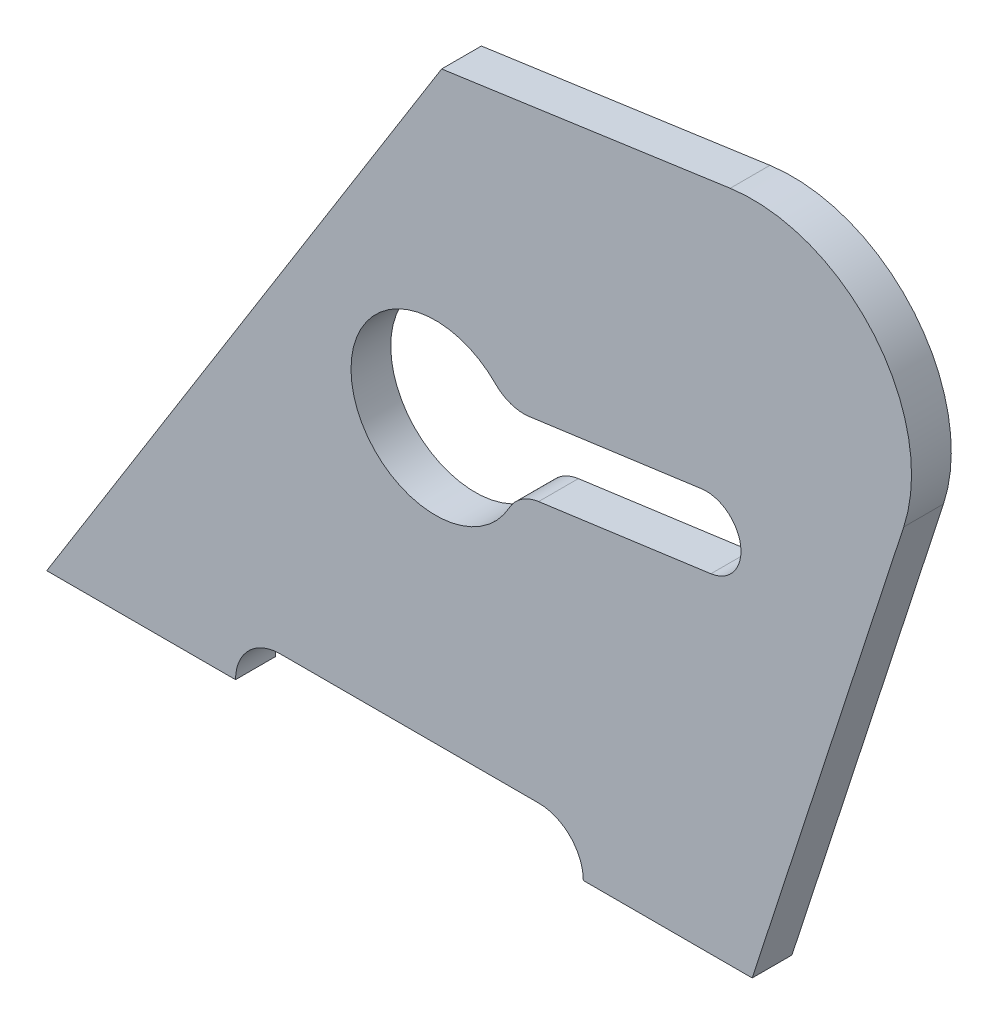
ISO-10303-21;
HEADER;
FILE_DESCRIPTION(('STEP AP214'),'2;1');
FILE_NAME('part.step','',(''),(''),'','','');
FILE_SCHEMA(('AUTOMOTIVE_DESIGN { 1 0 10303 214 1 1 1 1 }'));
ENDSEC;
DATA;
#1=APPLICATION_CONTEXT('core data for automotive mechanical design processes');
#2=APPLICATION_PROTOCOL_DEFINITION('international standard','automotive_design',2000,#1);
#3=PRODUCT_CONTEXT('',#1,'mechanical');
#4=PRODUCT('Part','Part','',(#3));
#5=PRODUCT_RELATED_PRODUCT_CATEGORY('part','',(#4));
#6=PRODUCT_DEFINITION_FORMATION('','',#4);
#7=PRODUCT_DEFINITION_CONTEXT('part definition',#1,'design');
#8=PRODUCT_DEFINITION('design','',#6,#7);
#9=PRODUCT_DEFINITION_SHAPE('','',#8);
#10=(LENGTH_UNIT() NAMED_UNIT(*) SI_UNIT(.MILLI.,.METRE.));
#11=(NAMED_UNIT(*) PLANE_ANGLE_UNIT() SI_UNIT($,.RADIAN.));
#12=(NAMED_UNIT(*) SI_UNIT($,.STERADIAN.) SOLID_ANGLE_UNIT());
#13=UNCERTAINTY_MEASURE_WITH_UNIT(LENGTH_MEASURE(1.E-05),#10,'distance_accuracy_value','');
#14=(GEOMETRIC_REPRESENTATION_CONTEXT(3) GLOBAL_UNCERTAINTY_ASSIGNED_CONTEXT((#13)) GLOBAL_UNIT_ASSIGNED_CONTEXT((#10,
#11,#12)) REPRESENTATION_CONTEXT('',''));
#15=CARTESIAN_POINT('',(0.,0.,0.));
#16=DIRECTION('',(0.,0.,1.));
#17=DIRECTION('',(1.,0.,0.));
#18=AXIS2_PLACEMENT_3D('',#15,#16,#17);
#19=CARTESIAN_POINT('',(142.06973961903,103.768811757372,8.));
#20=DIRECTION('',(0.,0.,1.));
#21=DIRECTION('',(1.,0.,0.));
#22=AXIS2_PLACEMENT_3D('',#19,#20,#21);
#23=PLANE('',#22);
#24=DIRECTION('',(1.,0.,0.));
#25=VECTOR('',#24,1.);
#26=CARTESIAN_POINT('',(38.,0.,8.));
#27=LINE('',#26,#25);
#28=CARTESIAN_POINT('',(0.,0.,8.));
#29=VERTEX_POINT('',#28);
#30=CARTESIAN_POINT('',(38.,0.,8.));
#31=VERTEX_POINT('',#30);
#32=EDGE_CURVE('E201',#29,#31,#27,.T.);
#33=ORIENTED_EDGE('',*,*,#32,.T.);
#34=CARTESIAN_POINT('',(47.,0.,8.));
#35=DIRECTION('',(0.,0.,-1.));
#36=DIRECTION('',(1.,0.,0.));
#37=AXIS2_PLACEMENT_3D('',#34,#35,#36);
#38=CIRCLE('',#37,9.);
#39=CARTESIAN_POINT('',(47.,8.99999999999999,8.));
#40=VERTEX_POINT('',#39);
#41=EDGE_CURVE('E204',#31,#40,#38,.T.);
#42=ORIENTED_EDGE('',*,*,#41,.T.);
#43=DIRECTION('',(1.,0.,0.));
#44=VECTOR('',#43,1.);
#45=CARTESIAN_POINT('',(99.,9.,8.));
#46=LINE('',#45,#44);
#47=CARTESIAN_POINT('',(99.,9.00000000000001,8.));
#48=VERTEX_POINT('',#47);
#49=EDGE_CURVE('E207',#40,#48,#46,.T.);
#50=ORIENTED_EDGE('',*,*,#49,.T.);
#51=CARTESIAN_POINT('',(99.,0.,8.));
#52=DIRECTION('',(0.,0.,-1.));
#53=DIRECTION('',(1.,0.,0.));
#54=AXIS2_PLACEMENT_3D('',#51,#52,#53);
#55=CIRCLE('',#54,9.);
#56=CARTESIAN_POINT('',(108.,0.,8.));
#57=VERTEX_POINT('',#56);
#58=EDGE_CURVE('E209',#48,#57,#55,.T.);
#59=ORIENTED_EDGE('',*,*,#58,.T.);
#60=DIRECTION('',(1.,0.,0.));
#61=VECTOR('',#60,1.);
#62=CARTESIAN_POINT('',(142.,0.,8.));
#63=LINE('',#62,#61);
#64=CARTESIAN_POINT('',(142.,0.,8.));
#65=VERTEX_POINT('',#64);
#66=EDGE_CURVE('E211',#57,#65,#63,.T.);
#67=ORIENTED_EDGE('',*,*,#66,.T.);
#68=DIRECTION('',(0.309016994374944,0.951056516295155,0.));
#69=VECTOR('',#68,1.);
#70=CARTESIAN_POINT('',(172.503548140475,93.8802679373736,8.));
#71=LINE('',#70,#69);
#72=CARTESIAN_POINT('',(172.503548140475,93.8802679373735,8.));
#73=VERTEX_POINT('',#72);
#74=EDGE_CURVE('E213',#65,#73,#71,.T.);
#75=ORIENTED_EDGE('',*,*,#74,.T.);
#76=CARTESIAN_POINT('',(142.06973961903,103.768811757372,8.));
#77=DIRECTION('',(0.,0.,1.));
#78=DIRECTION('',(1.,0.,0.));
#79=AXIS2_PLACEMENT_3D('',#76,#77,#78);
#80=CIRCLE('',#79,32.);
#81=CARTESIAN_POINT('',(137.573015723534,135.451290735628,8.));
#82=VERTEX_POINT('',#81);
#83=EDGE_CURVE('E215',#73,#82,#80,.T.);
#84=ORIENTED_EDGE('',*,*,#83,.T.);
#85=DIRECTION('',(-0.99007746807052,-0.140522621734257,0.));
#86=VECTOR('',#85,1.);
#87=CARTESIAN_POINT('',(79.4878896349813,127.207214423464,8.));
#88=LINE('',#87,#86);
#89=CARTESIAN_POINT('',(79.4878896349813,127.207214423464,8.));
#90=VERTEX_POINT('',#89);
#91=EDGE_CURVE('E217',#82,#90,#88,.T.);
#92=ORIENTED_EDGE('',*,*,#91,.T.);
#93=DIRECTION('',(-0.529919264233208,-0.848048096156424,0.));
#94=VECTOR('',#93,1.);
#95=CARTESIAN_POINT('',(0.,0.,8.));
#96=LINE('',#95,#94);
#97=EDGE_CURVE('E219',#90,#29,#96,.T.);
#98=ORIENTED_EDGE('',*,*,#97,.T.);
#99=EDGE_LOOP('',(#33,#42,#50,#59,#67,#75,#84,#92,#98));
#100=FACE_BOUND('',#99,.T.);
#101=DIRECTION('',(-0.990741207517111,-0.135763985384698,0.));
#102=VECTOR('',#101,1.);
#103=CARTESIAN_POINT('',(131.785075784508,80.1799458766568,8.));
#104=LINE('',#103,#102);
#105=CARTESIAN_POINT('',(131.785075784508,80.1799458766568,8.));
#106=VERTEX_POINT('',#105);
#107=CARTESIAN_POINT('',(97.1091335214087,75.4282063881924,8.));
#108=VERTEX_POINT('',#107);
#109=EDGE_CURVE('E158',#106,#108,#104,.T.);
#110=ORIENTED_EDGE('',*,*,#109,.F.);
#111=CARTESIAN_POINT('',(132.7354236822,73.2447574240371,8.));
#112=DIRECTION('',(0.,0.,1.));
#113=DIRECTION('',(-1.,0.,0.));
#114=AXIS2_PLACEMENT_3D('',#111,#112,#113);
#115=CIRCLE('',#114,6.99999999999998);
#116=CARTESIAN_POINT('',(133.685771579893,66.3095689714173,8.));
#117=VERTEX_POINT('',#116);
#118=EDGE_CURVE('E150',#117,#106,#115,.T.);
#119=ORIENTED_EDGE('',*,*,#118,.F.);
#120=DIRECTION('',(0.990741207517111,0.135763985384698,0.));
#121=VECTOR('',#120,1.);
#122=CARTESIAN_POINT('',(133.685771579893,66.3095689714173,8.));
#123=LINE('',#122,#121);
#124=CARTESIAN_POINT('',(99.0098293167945,61.5578294829529,8.));
#125=VERTEX_POINT('',#124);
#126=EDGE_CURVE('E179',#125,#117,#123,.T.);
#127=ORIENTED_EDGE('',*,*,#126,.F.);
#128=CARTESIAN_POINT('',(100.095941199872,53.6318998228159,8.));
#129=DIRECTION('',(0.,0.,-1.));
#130=DIRECTION('',(1.,0.,0.));
#131=AXIS2_PLACEMENT_3D('',#128,#129,#130);
#132=CIRCLE('',#131,8.00000000000003);
#133=CARTESIAN_POINT('',(93.1035303419159,57.518568112436,8.));
#134=VERTEX_POINT('',#133);
#135=EDGE_CURVE('E177',#134,#125,#132,.T.);
#136=ORIENTED_EDGE('',*,*,#135,.F.);
#137=CARTESIAN_POINT('',(78.2446572687594,65.7777382278787,8.));
#138=DIRECTION('',(0.,0.,1.));
#139=DIRECTION('',(1.,0.,0.));
#140=AXIS2_PLACEMENT_3D('',#137,#138,#139);
#141=CIRCLE('',#140,17.);
#142=CARTESIAN_POINT('',(90.3339450400682,77.7296887457851,8.));
#143=VERTEX_POINT('',#142);
#144=EDGE_CURVE('E173',#143,#134,#141,.T.);
#145=ORIENTED_EDGE('',*,*,#144,.F.);
#146=CARTESIAN_POINT('',(96.0230216383312,83.3541360483293,8.));
#147=DIRECTION('',(0.,0.,-1.));
#148=DIRECTION('',(1.,0.,0.));
#149=AXIS2_PLACEMENT_3D('',#146,#147,#148);
#150=CIRCLE('',#149,7.99999999999999);
#151=EDGE_CURVE('E171',#108,#143,#150,.T.);
#152=ORIENTED_EDGE('',*,*,#151,.F.);
#153=EDGE_LOOP('',(#110,#119,#127,#136,#145,#152));
#154=FACE_BOUND('',#153,.T.);
#155=ADVANCED_FACE('F43',(#100,#154),#23,.T.);
#156=CARTESIAN_POINT('',(142.06973961903,103.768811757372,0.));
#157=DIRECTION('',(0.,0.,1.));
#158=DIRECTION('',(1.,0.,0.));
#159=AXIS2_PLACEMENT_3D('',#156,#157,#158);
#160=PLANE('',#159);
#161=DIRECTION('',(1.,0.,0.));
#162=VECTOR('',#161,1.);
#163=CARTESIAN_POINT('',(38.,0.,0.));
#164=LINE('',#163,#162);
#165=CARTESIAN_POINT('',(0.,0.,0.));
#166=VERTEX_POINT('',#165);
#167=CARTESIAN_POINT('',(38.,0.,0.));
#168=VERTEX_POINT('',#167);
#169=EDGE_CURVE('E166',#166,#168,#164,.T.);
#170=ORIENTED_EDGE('',*,*,#169,.F.);
#171=DIRECTION('',(-0.529919264233208,-0.848048096156424,0.));
#172=VECTOR('',#171,1.);
#173=CARTESIAN_POINT('',(0.,0.,0.));
#174=LINE('',#173,#172);
#175=CARTESIAN_POINT('',(79.4878896349813,127.207214423464,0.));
#176=VERTEX_POINT('',#175);
#177=EDGE_CURVE('E205',#176,#166,#174,.T.);
#178=ORIENTED_EDGE('',*,*,#177,.F.);
#179=DIRECTION('',(-0.99007746807052,-0.140522621734257,0.));
#180=VECTOR('',#179,1.);
#181=CARTESIAN_POINT('',(79.4878896349813,127.207214423464,0.));
#182=LINE('',#181,#180);
#183=CARTESIAN_POINT('',(137.573015723534,135.451290735628,0.));
#184=VERTEX_POINT('',#183);
#185=EDGE_CURVE('E236',#184,#176,#182,.T.);
#186=ORIENTED_EDGE('',*,*,#185,.F.);
#187=CARTESIAN_POINT('',(142.06973961903,103.768811757372,0.));
#188=DIRECTION('',(0.,0.,1.));
#189=DIRECTION('',(1.,0.,0.));
#190=AXIS2_PLACEMENT_3D('',#187,#188,#189);
#191=CIRCLE('',#190,32.);
#192=CARTESIAN_POINT('',(172.503548140475,93.8802679373735,0.));
#193=VERTEX_POINT('',#192);
#194=EDGE_CURVE('E234',#193,#184,#191,.T.);
#195=ORIENTED_EDGE('',*,*,#194,.F.);
#196=DIRECTION('',(0.309016994374944,0.951056516295155,0.));
#197=VECTOR('',#196,1.);
#198=CARTESIAN_POINT('',(172.503548140475,93.8802679373736,0.));
#199=LINE('',#198,#197);
#200=CARTESIAN_POINT('',(142.,0.,0.));
#201=VERTEX_POINT('',#200);
#202=EDGE_CURVE('E232',#201,#193,#199,.T.);
#203=ORIENTED_EDGE('',*,*,#202,.F.);
#204=DIRECTION('',(1.,0.,0.));
#205=VECTOR('',#204,1.);
#206=CARTESIAN_POINT('',(142.,0.,0.));
#207=LINE('',#206,#205);
#208=CARTESIAN_POINT('',(108.,0.,0.));
#209=VERTEX_POINT('',#208);
#210=EDGE_CURVE('E230',#209,#201,#207,.T.);
#211=ORIENTED_EDGE('',*,*,#210,.F.);
#212=CARTESIAN_POINT('',(99.,0.,0.));
#213=DIRECTION('',(0.,0.,-1.));
#214=DIRECTION('',(1.,0.,0.));
#215=AXIS2_PLACEMENT_3D('',#212,#213,#214);
#216=CIRCLE('',#215,9.);
#217=CARTESIAN_POINT('',(99.,9.00000000000001,0.));
#218=VERTEX_POINT('',#217);
#219=EDGE_CURVE('E228',#218,#209,#216,.T.);
#220=ORIENTED_EDGE('',*,*,#219,.F.);
#221=DIRECTION('',(1.,0.,0.));
#222=VECTOR('',#221,1.);
#223=CARTESIAN_POINT('',(99.,9.,0.));
#224=LINE('',#223,#222);
#225=CARTESIAN_POINT('',(47.,8.99999999999999,0.));
#226=VERTEX_POINT('',#225);
#227=EDGE_CURVE('E226',#226,#218,#224,.T.);
#228=ORIENTED_EDGE('',*,*,#227,.F.);
#229=CARTESIAN_POINT('',(47.,0.,0.));
#230=DIRECTION('',(0.,0.,-1.));
#231=DIRECTION('',(1.,0.,0.));
#232=AXIS2_PLACEMENT_3D('',#229,#230,#231);
#233=CIRCLE('',#232,9.);
#234=EDGE_CURVE('E224',#168,#226,#233,.T.);
#235=ORIENTED_EDGE('',*,*,#234,.F.);
#236=EDGE_LOOP('',(#170,#178,#186,#195,#203,#211,#220,#228,#235));
#237=FACE_BOUND('',#236,.T.);
#238=CARTESIAN_POINT('',(132.7354236822,73.2447574240371,0.));
#239=DIRECTION('',(0.,0.,1.));
#240=DIRECTION('',(-1.,0.,0.));
#241=AXIS2_PLACEMENT_3D('',#238,#239,#240);
#242=CIRCLE('',#241,6.99999999999998);
#243=CARTESIAN_POINT('',(133.685771579893,66.3095689714173,0.));
#244=VERTEX_POINT('',#243);
#245=CARTESIAN_POINT('',(131.785075784508,80.1799458766568,0.));
#246=VERTEX_POINT('',#245);
#247=EDGE_CURVE('E66',#244,#246,#242,.T.);
#248=ORIENTED_EDGE('',*,*,#247,.T.);
#249=DIRECTION('',(-0.990741207517111,-0.135763985384698,0.));
#250=VECTOR('',#249,1.);
#251=CARTESIAN_POINT('',(131.785075784508,80.1799458766568,0.));
#252=LINE('',#251,#250);
#253=CARTESIAN_POINT('',(97.1091335214087,75.4282063881924,0.));
#254=VERTEX_POINT('',#253);
#255=EDGE_CURVE('E165',#246,#254,#252,.T.);
#256=ORIENTED_EDGE('',*,*,#255,.T.);
#257=CARTESIAN_POINT('',(96.0230216383312,83.3541360483293,0.));
#258=DIRECTION('',(0.,0.,-1.));
#259=DIRECTION('',(1.,0.,0.));
#260=AXIS2_PLACEMENT_3D('',#257,#258,#259);
#261=CIRCLE('',#260,7.99999999999999);
#262=CARTESIAN_POINT('',(90.3339450400682,77.7296887457851,0.));
#263=VERTEX_POINT('',#262);
#264=EDGE_CURVE('E183',#254,#263,#261,.T.);
#265=ORIENTED_EDGE('',*,*,#264,.T.);
#266=CARTESIAN_POINT('',(78.2446572687594,65.7777382278787,0.));
#267=DIRECTION('',(0.,0.,1.));
#268=DIRECTION('',(1.,0.,0.));
#269=AXIS2_PLACEMENT_3D('',#266,#267,#268);
#270=CIRCLE('',#269,17.);
#271=CARTESIAN_POINT('',(93.1035303419159,57.518568112436,0.));
#272=VERTEX_POINT('',#271);
#273=EDGE_CURVE('E186',#263,#272,#270,.T.);
#274=ORIENTED_EDGE('',*,*,#273,.T.);
#275=CARTESIAN_POINT('',(100.095941199872,53.6318998228159,0.));
#276=DIRECTION('',(0.,0.,-1.));
#277=DIRECTION('',(1.,0.,0.));
#278=AXIS2_PLACEMENT_3D('',#275,#276,#277);
#279=CIRCLE('',#278,8.00000000000003);
#280=CARTESIAN_POINT('',(99.0098293167945,61.5578294829529,0.));
#281=VERTEX_POINT('',#280);
#282=EDGE_CURVE('E189',#272,#281,#279,.T.);
#283=ORIENTED_EDGE('',*,*,#282,.T.);
#284=DIRECTION('',(0.990741207517111,0.135763985384698,0.));
#285=VECTOR('',#284,1.);
#286=CARTESIAN_POINT('',(133.685771579893,66.3095689714173,0.));
#287=LINE('',#286,#285);
#288=EDGE_CURVE('E159',#281,#244,#287,.T.);
#289=ORIENTED_EDGE('',*,*,#288,.T.);
#290=EDGE_LOOP('',(#248,#256,#265,#274,#283,#289));
#291=FACE_BOUND('',#290,.T.);
#292=ADVANCED_FACE('F269',(#237,#291),#160,.F.);
#293=CARTESIAN_POINT('',(38.,0.,8.));
#294=DIRECTION('',(0.,1.,0.));
#295=DIRECTION('',(0.,0.,1.));
#296=AXIS2_PLACEMENT_3D('',#293,#294,#295);
#297=PLANE('',#296);
#298=ORIENTED_EDGE('',*,*,#169,.T.);
#299=DIRECTION('',(0.,0.,-1.));
#300=VECTOR('',#299,1.);
#301=CARTESIAN_POINT('',(38.,0.,8.));
#302=LINE('',#301,#300);
#303=EDGE_CURVE('E11',#31,#168,#302,.T.);
#304=ORIENTED_EDGE('',*,*,#303,.F.);
#305=ORIENTED_EDGE('',*,*,#32,.F.);
#306=DIRECTION('',(0.,0.,-1.));
#307=VECTOR('',#306,1.);
#308=CARTESIAN_POINT('',(0.,0.,8.));
#309=LINE('',#308,#307);
#310=EDGE_CURVE('E221',#29,#166,#309,.T.);
#311=ORIENTED_EDGE('',*,*,#310,.T.);
#312=EDGE_LOOP('',(#298,#304,#305,#311));
#313=FACE_BOUND('',#312,.T.);
#314=ADVANCED_FACE('F45',(#313),#297,.F.);
#315=CARTESIAN_POINT('',(47.,0.,8.));
#316=DIRECTION('',(0.,0.,-1.));
#317=DIRECTION('',(-1.,0.,0.));
#318=AXIS2_PLACEMENT_3D('',#315,#316,#317);
#319=CYLINDRICAL_SURFACE('',#318,9.);
#320=ORIENTED_EDGE('',*,*,#234,.T.);
#321=DIRECTION('',(0.,0.,-1.));
#322=VECTOR('',#321,1.);
#323=CARTESIAN_POINT('',(47.,8.99999999999999,8.));
#324=LINE('',#323,#322);
#325=EDGE_CURVE('E51',#40,#226,#324,.T.);
#326=ORIENTED_EDGE('',*,*,#325,.F.);
#327=ORIENTED_EDGE('',*,*,#41,.F.);
#328=ORIENTED_EDGE('',*,*,#303,.T.);
#329=EDGE_LOOP('',(#320,#326,#327,#328));
#330=FACE_BOUND('',#329,.T.);
#331=ADVANCED_FACE('F286',(#330),#319,.F.);
#332=CARTESIAN_POINT('',(99.,9.,8.));
#333=DIRECTION('',(0.,1.,0.));
#334=DIRECTION('',(-1.,0.,0.));
#335=AXIS2_PLACEMENT_3D('',#332,#333,#334);
#336=PLANE('',#335);
#337=ORIENTED_EDGE('',*,*,#227,.T.);
#338=DIRECTION('',(0.,0.,-1.));
#339=VECTOR('',#338,1.);
#340=CARTESIAN_POINT('',(99.,9.00000000000001,8.));
#341=LINE('',#340,#339);
#342=EDGE_CURVE('E256',#48,#218,#341,.T.);
#343=ORIENTED_EDGE('',*,*,#342,.F.);
#344=ORIENTED_EDGE('',*,*,#49,.F.);
#345=ORIENTED_EDGE('',*,*,#325,.T.);
#346=EDGE_LOOP('',(#337,#343,#344,#345));
#347=FACE_BOUND('',#346,.T.);
#348=ADVANCED_FACE('F263',(#347),#336,.F.);
#349=CARTESIAN_POINT('',(99.,0.,8.));
#350=DIRECTION('',(0.,0.,-1.));
#351=DIRECTION('',(-1.,0.,0.));
#352=AXIS2_PLACEMENT_3D('',#349,#350,#351);
#353=CYLINDRICAL_SURFACE('',#352,9.);
#354=ORIENTED_EDGE('',*,*,#219,.T.);
#355=DIRECTION('',(0.,0.,-1.));
#356=VECTOR('',#355,1.);
#357=CARTESIAN_POINT('',(108.,0.,8.));
#358=LINE('',#357,#356);
#359=EDGE_CURVE('E253',#57,#209,#358,.T.);
#360=ORIENTED_EDGE('',*,*,#359,.F.);
#361=ORIENTED_EDGE('',*,*,#58,.F.);
#362=ORIENTED_EDGE('',*,*,#342,.T.);
#363=EDGE_LOOP('',(#354,#360,#361,#362));
#364=FACE_BOUND('',#363,.T.);
#365=ADVANCED_FACE('F275',(#364),#353,.F.);
#366=CARTESIAN_POINT('',(142.,0.,8.));
#367=DIRECTION('',(0.,1.,0.));
#368=DIRECTION('',(0.,0.,1.));
#369=AXIS2_PLACEMENT_3D('',#366,#367,#368);
#370=PLANE('',#369);
#371=ORIENTED_EDGE('',*,*,#210,.T.);
#372=DIRECTION('',(0.,0.,-1.));
#373=VECTOR('',#372,1.);
#374=CARTESIAN_POINT('',(142.,0.,8.));
#375=LINE('',#374,#373);
#376=EDGE_CURVE('E250',#65,#201,#375,.T.);
#377=ORIENTED_EDGE('',*,*,#376,.F.);
#378=ORIENTED_EDGE('',*,*,#66,.F.);
#379=ORIENTED_EDGE('',*,*,#359,.T.);
#380=EDGE_LOOP('',(#371,#377,#378,#379));
#381=FACE_BOUND('',#380,.T.);
#382=ADVANCED_FACE('F279',(#381),#370,.F.);
#383=CARTESIAN_POINT('',(172.503548140475,93.8802679373736,8.));
#384=DIRECTION('',(-0.951056516295155,0.309016994374944,0.));
#385=DIRECTION('',(-0.309016994374944,-0.951056516295155,0.));
#386=AXIS2_PLACEMENT_3D('',#383,#384,#385);
#387=PLANE('',#386);
#388=ORIENTED_EDGE('',*,*,#202,.T.);
#389=DIRECTION('',(0.,0.,-1.));
#390=VECTOR('',#389,1.);
#391=CARTESIAN_POINT('',(172.503548140475,93.8802679373735,8.));
#392=LINE('',#391,#390);
#393=EDGE_CURVE('E247',#73,#193,#392,.T.);
#394=ORIENTED_EDGE('',*,*,#393,.F.);
#395=ORIENTED_EDGE('',*,*,#74,.F.);
#396=ORIENTED_EDGE('',*,*,#376,.T.);
#397=EDGE_LOOP('',(#388,#394,#395,#396));
#398=FACE_BOUND('',#397,.T.);
#399=ADVANCED_FACE('F304',(#398),#387,.F.);
#400=CARTESIAN_POINT('',(142.06973961903,103.768811757372,8.));
#401=DIRECTION('',(0.,0.,-1.));
#402=DIRECTION('',(-1.,0.,0.));
#403=AXIS2_PLACEMENT_3D('',#400,#401,#402);
#404=CYLINDRICAL_SURFACE('',#403,32.);
#405=ORIENTED_EDGE('',*,*,#194,.T.);
#406=DIRECTION('',(0.,0.,-1.));
#407=VECTOR('',#406,1.);
#408=CARTESIAN_POINT('',(137.573015723534,135.451290735628,8.));
#409=LINE('',#408,#407);
#410=EDGE_CURVE('E244',#82,#184,#409,.T.);
#411=ORIENTED_EDGE('',*,*,#410,.F.);
#412=ORIENTED_EDGE('',*,*,#83,.F.);
#413=ORIENTED_EDGE('',*,*,#393,.T.);
#414=EDGE_LOOP('',(#405,#411,#412,#413));
#415=FACE_BOUND('',#414,.T.);
#416=ADVANCED_FACE('F302',(#415),#404,.T.);
#417=CARTESIAN_POINT('',(79.4878896349813,127.207214423464,8.));
#418=DIRECTION('',(0.140522621734257,-0.99007746807052,0.));
#419=DIRECTION('',(0.99007746807052,0.140522621734257,0.));
#420=AXIS2_PLACEMENT_3D('',#417,#418,#419);
#421=PLANE('',#420);
#422=ORIENTED_EDGE('',*,*,#185,.T.);
#423=DIRECTION('',(0.,0.,-1.));
#424=VECTOR('',#423,1.);
#425=CARTESIAN_POINT('',(79.4878896349813,127.207214423464,8.));
#426=LINE('',#425,#424);
#427=EDGE_CURVE('E241',#90,#176,#426,.T.);
#428=ORIENTED_EDGE('',*,*,#427,.F.);
#429=ORIENTED_EDGE('',*,*,#91,.F.);
#430=ORIENTED_EDGE('',*,*,#410,.T.);
#431=EDGE_LOOP('',(#422,#428,#429,#430));
#432=FACE_BOUND('',#431,.T.);
#433=ADVANCED_FACE('F298',(#432),#421,.F.);
#434=CARTESIAN_POINT('',(0.,0.,8.));
#435=DIRECTION('',(0.848048096156424,-0.529919264233208,0.));
#436=DIRECTION('',(0.529919264233208,0.848048096156424,0.));
#437=AXIS2_PLACEMENT_3D('',#434,#435,#436);
#438=PLANE('',#437);
#439=ORIENTED_EDGE('',*,*,#177,.T.);
#440=ORIENTED_EDGE('',*,*,#310,.F.);
#441=ORIENTED_EDGE('',*,*,#97,.F.);
#442=ORIENTED_EDGE('',*,*,#427,.T.);
#443=EDGE_LOOP('',(#439,#440,#441,#442));
#444=FACE_BOUND('',#443,.T.);
#445=ADVANCED_FACE('F293',(#444),#438,.F.);
#446=CARTESIAN_POINT('',(132.7354236822,73.2447574240371,8.));
#447=DIRECTION('',(0.,0.,-1.));
#448=DIRECTION('',(-1.,0.,0.));
#449=AXIS2_PLACEMENT_3D('',#446,#447,#448);
#450=CYLINDRICAL_SURFACE('',#449,6.99999999999998);
#451=ORIENTED_EDGE('',*,*,#247,.F.);
#452=DIRECTION('',(0.,0.,-1.));
#453=VECTOR('',#452,1.);
#454=CARTESIAN_POINT('',(133.685771579893,66.3095689714173,8.));
#455=LINE('',#454,#453);
#456=EDGE_CURVE('E154',#117,#244,#455,.T.);
#457=ORIENTED_EDGE('',*,*,#456,.F.);
#458=ORIENTED_EDGE('',*,*,#118,.T.);
#459=DIRECTION('',(0.,0.,-1.));
#460=VECTOR('',#459,1.);
#461=CARTESIAN_POINT('',(131.785075784508,80.1799458766568,8.));
#462=LINE('',#461,#460);
#463=EDGE_CURVE('E153',#106,#246,#462,.T.);
#464=ORIENTED_EDGE('',*,*,#463,.T.);
#465=EDGE_LOOP('',(#451,#457,#458,#464));
#466=FACE_BOUND('',#465,.T.);
#467=ADVANCED_FACE('F152',(#466),#450,.F.);
#468=CARTESIAN_POINT('',(131.785075784508,80.1799458766568,8.));
#469=DIRECTION('',(0.135763985384698,-0.990741207517111,0.));
#470=DIRECTION('',(0.990741207517111,0.135763985384698,0.));
#471=AXIS2_PLACEMENT_3D('',#468,#469,#470);
#472=PLANE('',#471);
#473=ORIENTED_EDGE('',*,*,#255,.F.);
#474=ORIENTED_EDGE('',*,*,#463,.F.);
#475=ORIENTED_EDGE('',*,*,#109,.T.);
#476=DIRECTION('',(0.,0.,-1.));
#477=VECTOR('',#476,1.);
#478=CARTESIAN_POINT('',(97.1091335214087,75.4282063881924,8.));
#479=LINE('',#478,#477);
#480=EDGE_CURVE('E167',#108,#254,#479,.T.);
#481=ORIENTED_EDGE('',*,*,#480,.T.);
#482=EDGE_LOOP('',(#473,#474,#475,#481));
#483=FACE_BOUND('',#482,.T.);
#484=ADVANCED_FACE('F162',(#483),#472,.T.);
#485=CARTESIAN_POINT('',(96.0230216383312,83.3541360483293,8.));
#486=DIRECTION('',(0.,0.,-1.));
#487=DIRECTION('',(-1.,0.,0.));
#488=AXIS2_PLACEMENT_3D('',#485,#486,#487);
#489=CYLINDRICAL_SURFACE('',#488,7.99999999999999);
#490=ORIENTED_EDGE('',*,*,#264,.F.);
#491=ORIENTED_EDGE('',*,*,#480,.F.);
#492=ORIENTED_EDGE('',*,*,#151,.T.);
#493=DIRECTION('',(0.,0.,-1.));
#494=VECTOR('',#493,1.);
#495=CARTESIAN_POINT('',(90.3339450400682,77.7296887457851,8.));
#496=LINE('',#495,#494);
#497=EDGE_CURVE('E198',#143,#263,#496,.T.);
#498=ORIENTED_EDGE('',*,*,#497,.T.);
#499=EDGE_LOOP('',(#490,#491,#492,#498));
#500=FACE_BOUND('',#499,.T.);
#501=ADVANCED_FACE('F347',(#500),#489,.T.);
#502=CARTESIAN_POINT('',(78.2446572687594,65.7777382278787,8.));
#503=DIRECTION('',(0.,0.,-1.));
#504=DIRECTION('',(-1.,0.,0.));
#505=AXIS2_PLACEMENT_3D('',#502,#503,#504);
#506=CYLINDRICAL_SURFACE('',#505,17.);
#507=ORIENTED_EDGE('',*,*,#273,.F.);
#508=ORIENTED_EDGE('',*,*,#497,.F.);
#509=ORIENTED_EDGE('',*,*,#144,.T.);
#510=DIRECTION('',(0.,0.,-1.));
#511=VECTOR('',#510,1.);
#512=CARTESIAN_POINT('',(93.1035303419159,57.518568112436,8.));
#513=LINE('',#512,#511);
#514=EDGE_CURVE('E196',#134,#272,#513,.T.);
#515=ORIENTED_EDGE('',*,*,#514,.T.);
#516=EDGE_LOOP('',(#507,#508,#509,#515));
#517=FACE_BOUND('',#516,.T.);
#518=ADVANCED_FACE('F354',(#517),#506,.F.);
#519=CARTESIAN_POINT('',(100.095941199872,53.6318998228159,8.));
#520=DIRECTION('',(0.,0.,-1.));
#521=DIRECTION('',(-1.,0.,0.));
#522=AXIS2_PLACEMENT_3D('',#519,#520,#521);
#523=CYLINDRICAL_SURFACE('',#522,8.00000000000003);
#524=ORIENTED_EDGE('',*,*,#282,.F.);
#525=ORIENTED_EDGE('',*,*,#514,.F.);
#526=ORIENTED_EDGE('',*,*,#135,.T.);
#527=DIRECTION('',(0.,0.,-1.));
#528=VECTOR('',#527,1.);
#529=CARTESIAN_POINT('',(99.0098293167945,61.5578294829529,8.));
#530=LINE('',#529,#528);
#531=EDGE_CURVE('E58',#125,#281,#530,.T.);
#532=ORIENTED_EDGE('',*,*,#531,.T.);
#533=EDGE_LOOP('',(#524,#525,#526,#532));
#534=FACE_BOUND('',#533,.T.);
#535=ADVANCED_FACE('F363',(#534),#523,.T.);
#536=CARTESIAN_POINT('',(133.685771579893,66.3095689714173,8.));
#537=DIRECTION('',(-0.135763985384698,0.990741207517111,0.));
#538=DIRECTION('',(-0.990741207517111,-0.135763985384698,0.));
#539=AXIS2_PLACEMENT_3D('',#536,#537,#538);
#540=PLANE('',#539);
#541=ORIENTED_EDGE('',*,*,#288,.F.);
#542=ORIENTED_EDGE('',*,*,#531,.F.);
#543=ORIENTED_EDGE('',*,*,#126,.T.);
#544=ORIENTED_EDGE('',*,*,#456,.T.);
#545=EDGE_LOOP('',(#541,#542,#543,#544));
#546=FACE_BOUND('',#545,.T.);
#547=ADVANCED_FACE('F372',(#546),#540,.T.);
#548=CLOSED_SHELL('',(#155,#292,#314,#331,#348,#365,#382,#399,#416,#433,#445,#467,#484,#501,
#518,#535,#547));
#549=MANIFOLD_SOLID_BREP('B2',#548);
#550=ADVANCED_BREP_SHAPE_REPRESENTATION('',(#18,#549),#14);
#551=SHAPE_DEFINITION_REPRESENTATION(#9,#550);
ENDSEC;
END-ISO-10303-21;
